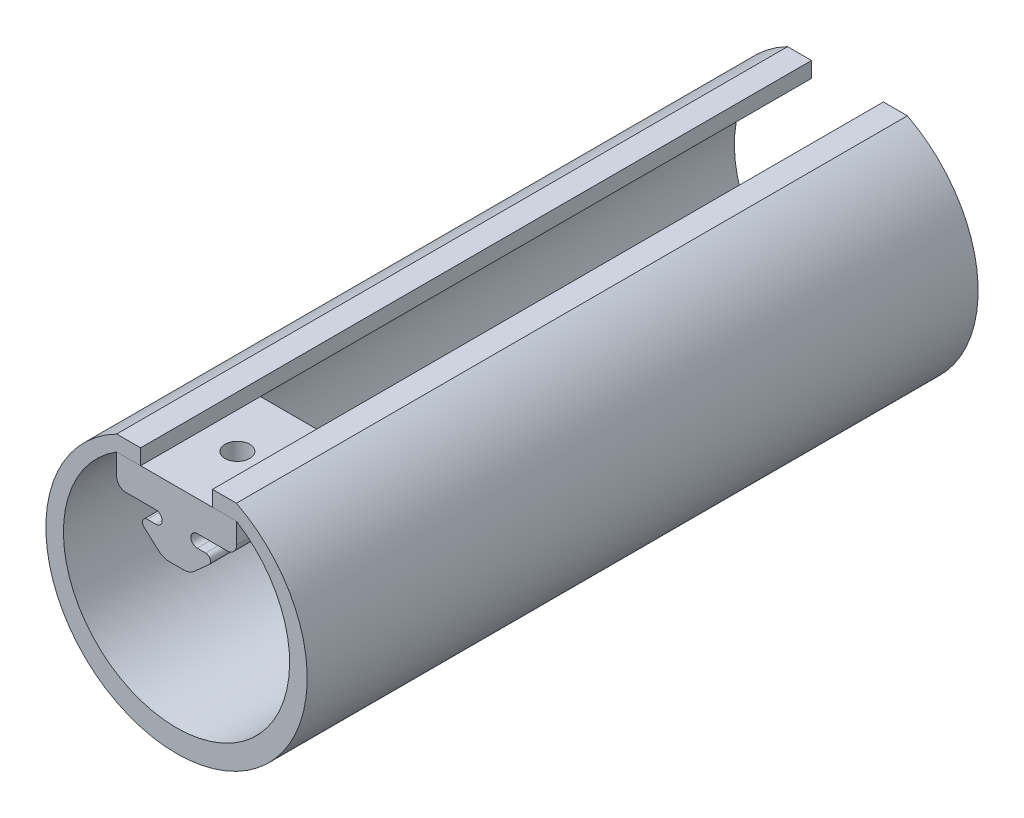
ISO-10303-21;
HEADER;
FILE_DESCRIPTION(('STEP AP214'),'2;1');
FILE_NAME('part.step','',(''),(''),'','','');
FILE_SCHEMA(('AUTOMOTIVE_DESIGN { 1 0 10303 214 1 1 1 1 }'));
ENDSEC;
DATA;
#1=APPLICATION_CONTEXT('core data for automotive mechanical design processes');
#2=APPLICATION_PROTOCOL_DEFINITION('international standard','automotive_design',2000,#1);
#3=PRODUCT_CONTEXT('',#1,'mechanical');
#4=PRODUCT('Part','Part','',(#3));
#5=PRODUCT_RELATED_PRODUCT_CATEGORY('part','',(#4));
#6=PRODUCT_DEFINITION_FORMATION('','',#4);
#7=PRODUCT_DEFINITION_CONTEXT('part definition',#1,'design');
#8=PRODUCT_DEFINITION('design','',#6,#7);
#9=PRODUCT_DEFINITION_SHAPE('','',#8);
#10=(LENGTH_UNIT() NAMED_UNIT(*) SI_UNIT(.MILLI.,.METRE.));
#11=(NAMED_UNIT(*) PLANE_ANGLE_UNIT() SI_UNIT($,.RADIAN.));
#12=(NAMED_UNIT(*) SI_UNIT($,.STERADIAN.) SOLID_ANGLE_UNIT());
#13=UNCERTAINTY_MEASURE_WITH_UNIT(LENGTH_MEASURE(1.E-05),#10,'distance_accuracy_value','');
#14=(GEOMETRIC_REPRESENTATION_CONTEXT(3) GLOBAL_UNCERTAINTY_ASSIGNED_CONTEXT((#13)) GLOBAL_UNIT_ASSIGNED_CONTEXT((#10,
#11,#12)) REPRESENTATION_CONTEXT('',''));
#15=CARTESIAN_POINT('',(0.,0.,0.));
#16=DIRECTION('',(0.,0.,1.));
#17=DIRECTION('',(1.,0.,0.));
#18=AXIS2_PLACEMENT_3D('',#15,#16,#17);
#19=CARTESIAN_POINT('',(0.00499999999999459,-0.919738421910336,-140.));
#20=DIRECTION('',(0.,0.,1.));
#21=DIRECTION('',(1.,0.,0.));
#22=AXIS2_PLACEMENT_3D('',#19,#20,#21);
#23=CYLINDRICAL_SURFACE('',#22,23.5974522798012);
#24=CARTESIAN_POINT('',(0.00499999999999459,-0.919738421910336,0.));
#25=DIRECTION('',(0.,0.,1.));
#26=DIRECTION('',(1.,0.,0.));
#27=AXIS2_PLACEMENT_3D('',#24,#25,#26);
#28=CIRCLE('',#27,23.5974522798012);
#29=CARTESIAN_POINT('',(-12.495,19.095,0.));
#30=VERTEX_POINT('',#29);
#31=CARTESIAN_POINT('',(12.505,19.095,0.));
#32=VERTEX_POINT('',#31);
#33=EDGE_CURVE('E158',#30,#32,#28,.T.);
#34=ORIENTED_EDGE('',*,*,#33,.T.);
#35=DIRECTION('',(0.,0.,1.));
#36=VECTOR('',#35,1.);
#37=CARTESIAN_POINT('',(12.505,19.095,-140.));
#38=LINE('',#37,#36);
#39=CARTESIAN_POINT('',(12.505,19.095,-140.));
#40=VERTEX_POINT('',#39);
#41=EDGE_CURVE('E12',#40,#32,#38,.T.);
#42=ORIENTED_EDGE('',*,*,#41,.F.);
#43=CARTESIAN_POINT('',(0.00499999999999459,-0.919738421910336,-140.));
#44=DIRECTION('',(0.,0.,1.));
#45=DIRECTION('',(1.,0.,0.));
#46=AXIS2_PLACEMENT_3D('',#43,#44,#45);
#47=CIRCLE('',#46,23.5974522798012);
#48=CARTESIAN_POINT('',(-12.495,19.095,-140.));
#49=VERTEX_POINT('',#48);
#50=EDGE_CURVE('E181',#49,#40,#47,.T.);
#51=ORIENTED_EDGE('',*,*,#50,.F.);
#52=DIRECTION('',(0.,0.,1.));
#53=VECTOR('',#52,1.);
#54=CARTESIAN_POINT('',(-12.495,19.095,-140.));
#55=LINE('',#54,#53);
#56=EDGE_CURVE('E62',#49,#30,#55,.T.);
#57=ORIENTED_EDGE('',*,*,#56,.T.);
#58=EDGE_LOOP('',(#34,#42,#51,#57));
#59=FACE_BOUND('',#58,.T.);
#60=ADVANCED_FACE('F59',(#59),#23,.F.);
#61=CARTESIAN_POINT('',(0.,19.095,-140.));
#62=DIRECTION('',(0.,1.,0.));
#63=DIRECTION('',(0.,0.,1.));
#64=AXIS2_PLACEMENT_3D('',#61,#62,#63);
#65=PLANE('',#64);
#66=DIRECTION('',(-1.,0.,0.));
#67=VECTOR('',#66,1.);
#68=CARTESIAN_POINT('',(0.,19.095,0.));
#69=LINE('',#68,#67);
#70=CARTESIAN_POINT('',(7.50499999999998,19.095,0.));
#71=VERTEX_POINT('',#70);
#72=EDGE_CURVE('E111',#32,#71,#69,.T.);
#73=ORIENTED_EDGE('',*,*,#72,.T.);
#74=DIRECTION('',(0.,0.,1.));
#75=VECTOR('',#74,1.);
#76=CARTESIAN_POINT('',(7.50499999999998,19.095,-140.));
#77=LINE('',#76,#75);
#78=CARTESIAN_POINT('',(7.50499999999998,19.095,-140.));
#79=VERTEX_POINT('',#78);
#80=EDGE_CURVE('E69',#79,#71,#77,.T.);
#81=ORIENTED_EDGE('',*,*,#80,.F.);
#82=DIRECTION('',(-1.,0.,0.));
#83=VECTOR('',#82,1.);
#84=CARTESIAN_POINT('',(0.,19.095,-140.));
#85=LINE('',#84,#83);
#86=EDGE_CURVE('E77',#40,#79,#85,.T.);
#87=ORIENTED_EDGE('',*,*,#86,.F.);
#88=ORIENTED_EDGE('',*,*,#41,.T.);
#89=EDGE_LOOP('',(#73,#81,#87,#88));
#90=FACE_BOUND('',#89,.T.);
#91=ADVANCED_FACE('F219',(#90),#65,.F.);
#92=CARTESIAN_POINT('',(7.50499999999998,0.,-140.));
#93=DIRECTION('',(-1.,0.,0.));
#94=DIRECTION('',(0.,0.,1.));
#95=AXIS2_PLACEMENT_3D('',#92,#93,#94);
#96=PLANE('',#95);
#97=DIRECTION('',(0.,-1.,0.));
#98=VECTOR('',#97,1.);
#99=CARTESIAN_POINT('',(7.50499999999998,0.,0.));
#100=LINE('',#99,#98);
#101=CARTESIAN_POINT('',(7.50499999999998,22.3323580948041,0.));
#102=VERTEX_POINT('',#101);
#103=EDGE_CURVE('E136',#102,#71,#100,.T.);
#104=ORIENTED_EDGE('',*,*,#103,.F.);
#105=DIRECTION('',(0.,0.,1.));
#106=VECTOR('',#105,1.);
#107=CARTESIAN_POINT('',(7.50499999999998,22.3323580948041,-140.));
#108=LINE('',#107,#106);
#109=CARTESIAN_POINT('',(7.50499999999998,22.3323580948041,-140.));
#110=VERTEX_POINT('',#109);
#111=EDGE_CURVE('E131',#110,#102,#108,.T.);
#112=ORIENTED_EDGE('',*,*,#111,.F.);
#113=DIRECTION('',(0.,-1.,0.));
#114=VECTOR('',#113,1.);
#115=CARTESIAN_POINT('',(7.50499999999998,0.,-140.));
#116=LINE('',#115,#114);
#117=EDGE_CURVE('E135',#110,#79,#116,.T.);
#118=ORIENTED_EDGE('',*,*,#117,.T.);
#119=ORIENTED_EDGE('',*,*,#80,.T.);
#120=EDGE_LOOP('',(#104,#112,#118,#119));
#121=FACE_BOUND('',#120,.T.);
#122=ADVANCED_FACE('F133',(#121),#96,.T.);
#123=CARTESIAN_POINT('',(0.,22.3323580948041,-140.));
#124=DIRECTION('',(0.,-1.,0.));
#125=DIRECTION('',(0.,0.,-1.));
#126=AXIS2_PLACEMENT_3D('',#123,#124,#125);
#127=PLANE('',#126);
#128=DIRECTION('',(1.,0.,0.));
#129=VECTOR('',#128,1.);
#130=CARTESIAN_POINT('',(0.,22.3323580948041,0.));
#131=LINE('',#130,#129);
#132=CARTESIAN_POINT('',(12.505,22.3323580948041,0.));
#133=VERTEX_POINT('',#132);
#134=EDGE_CURVE('E175',#102,#133,#131,.T.);
#135=ORIENTED_EDGE('',*,*,#134,.T.);
#136=DIRECTION('',(0.,0.,1.));
#137=VECTOR('',#136,1.);
#138=CARTESIAN_POINT('',(12.505,22.3323580948041,-140.));
#139=LINE('',#138,#137);
#140=CARTESIAN_POINT('',(12.505,22.3323580948041,-140.));
#141=VERTEX_POINT('',#140);
#142=EDGE_CURVE('E141',#141,#133,#139,.T.);
#143=ORIENTED_EDGE('',*,*,#142,.F.);
#144=DIRECTION('',(1.,0.,0.));
#145=VECTOR('',#144,1.);
#146=CARTESIAN_POINT('',(0.,22.3323580948041,-140.));
#147=LINE('',#146,#145);
#148=EDGE_CURVE('E144',#110,#141,#147,.T.);
#149=ORIENTED_EDGE('',*,*,#148,.F.);
#150=ORIENTED_EDGE('',*,*,#111,.T.);
#151=EDGE_LOOP('',(#135,#143,#149,#150));
#152=FACE_BOUND('',#151,.T.);
#153=ADVANCED_FACE('F145',(#152),#127,.F.);
#154=CARTESIAN_POINT('',(0.00499999999999459,-1.9006750931802,-140.));
#155=DIRECTION('',(0.,0.,1.));
#156=DIRECTION('',(1.,0.,0.));
#157=AXIS2_PLACEMENT_3D('',#154,#155,#156);
#158=CYLINDRICAL_SURFACE('',#157,27.2670111579899);
#159=CARTESIAN_POINT('',(0.00499999999999459,-1.9006750931802,0.));
#160=DIRECTION('',(0.,0.,1.));
#161=DIRECTION('',(1.,0.,0.));
#162=AXIS2_PLACEMENT_3D('',#159,#160,#161);
#163=CIRCLE('',#162,27.2670111579899);
#164=CARTESIAN_POINT('',(-12.495,22.3323580948041,0.));
#165=VERTEX_POINT('',#164);
#166=EDGE_CURVE('E171',#165,#133,#163,.T.);
#167=ORIENTED_EDGE('',*,*,#166,.F.);
#168=DIRECTION('',(0.,0.,1.));
#169=VECTOR('',#168,1.);
#170=CARTESIAN_POINT('',(-12.495,22.3323580948041,-140.));
#171=LINE('',#170,#169);
#172=CARTESIAN_POINT('',(-12.495,22.3323580948041,-140.));
#173=VERTEX_POINT('',#172);
#174=EDGE_CURVE('E187',#173,#165,#171,.T.);
#175=ORIENTED_EDGE('',*,*,#174,.F.);
#176=CARTESIAN_POINT('',(0.00499999999999459,-1.9006750931802,-140.));
#177=DIRECTION('',(0.,0.,1.));
#178=DIRECTION('',(1.,0.,0.));
#179=AXIS2_PLACEMENT_3D('',#176,#177,#178);
#180=CIRCLE('',#179,27.2670111579899);
#181=EDGE_CURVE('E149',#173,#141,#180,.T.);
#182=ORIENTED_EDGE('',*,*,#181,.T.);
#183=ORIENTED_EDGE('',*,*,#142,.T.);
#184=EDGE_LOOP('',(#167,#175,#182,#183));
#185=FACE_BOUND('',#184,.T.);
#186=ADVANCED_FACE('F232',(#185),#158,.T.);
#187=CARTESIAN_POINT('',(0.,22.3323580948041,-140.));
#188=DIRECTION('',(0.,-1.,0.));
#189=DIRECTION('',(0.,0.,-1.));
#190=AXIS2_PLACEMENT_3D('',#187,#188,#189);
#191=PLANE('',#190);
#192=DIRECTION('',(1.,0.,0.));
#193=VECTOR('',#192,1.);
#194=CARTESIAN_POINT('',(0.,22.3323580948041,0.));
#195=LINE('',#194,#193);
#196=CARTESIAN_POINT('',(-7.49499999999999,22.3323580948041,0.));
#197=VERTEX_POINT('',#196);
#198=EDGE_CURVE('E168',#165,#197,#195,.T.);
#199=ORIENTED_EDGE('',*,*,#198,.T.);
#200=DIRECTION('',(0.,0.,1.));
#201=VECTOR('',#200,1.);
#202=CARTESIAN_POINT('',(-7.49499999999999,22.3323580948041,-140.));
#203=LINE('',#202,#201);
#204=CARTESIAN_POINT('',(-7.49499999999999,22.3323580948041,-140.));
#205=VERTEX_POINT('',#204);
#206=EDGE_CURVE('E190',#205,#197,#203,.T.);
#207=ORIENTED_EDGE('',*,*,#206,.F.);
#208=DIRECTION('',(1.,0.,0.));
#209=VECTOR('',#208,1.);
#210=CARTESIAN_POINT('',(0.,22.3323580948041,-140.));
#211=LINE('',#210,#209);
#212=EDGE_CURVE('E246',#173,#205,#211,.T.);
#213=ORIENTED_EDGE('',*,*,#212,.F.);
#214=ORIENTED_EDGE('',*,*,#174,.T.);
#215=EDGE_LOOP('',(#199,#207,#213,#214));
#216=FACE_BOUND('',#215,.T.);
#217=ADVANCED_FACE('F215',(#216),#191,.F.);
#218=CARTESIAN_POINT('',(-7.49499999999999,0.,-140.));
#219=DIRECTION('',(-1.,0.,0.));
#220=DIRECTION('',(0.,-1.,0.));
#221=AXIS2_PLACEMENT_3D('',#218,#219,#220);
#222=PLANE('',#221);
#223=DIRECTION('',(0.,-1.,0.));
#224=VECTOR('',#223,1.);
#225=CARTESIAN_POINT('',(-7.49499999999999,0.,0.));
#226=LINE('',#225,#224);
#227=CARTESIAN_POINT('',(-7.49499999999999,19.095,0.));
#228=VERTEX_POINT('',#227);
#229=EDGE_CURVE('E165',#197,#228,#226,.T.);
#230=ORIENTED_EDGE('',*,*,#229,.T.);
#231=DIRECTION('',(0.,0.,1.));
#232=VECTOR('',#231,1.);
#233=CARTESIAN_POINT('',(-7.49499999999999,19.095,-140.));
#234=LINE('',#233,#232);
#235=CARTESIAN_POINT('',(-7.49499999999999,19.095,-140.));
#236=VERTEX_POINT('',#235);
#237=EDGE_CURVE('E193',#236,#228,#234,.T.);
#238=ORIENTED_EDGE('',*,*,#237,.F.);
#239=DIRECTION('',(0.,-1.,0.));
#240=VECTOR('',#239,1.);
#241=CARTESIAN_POINT('',(-7.49499999999999,0.,-140.));
#242=LINE('',#241,#240);
#243=EDGE_CURVE('E244',#205,#236,#242,.T.);
#244=ORIENTED_EDGE('',*,*,#243,.F.);
#245=ORIENTED_EDGE('',*,*,#206,.T.);
#246=EDGE_LOOP('',(#230,#238,#244,#245));
#247=FACE_BOUND('',#246,.T.);
#248=ADVANCED_FACE('F209',(#247),#222,.F.);
#249=CARTESIAN_POINT('',(0.,19.095,-140.));
#250=DIRECTION('',(0.,1.,0.));
#251=DIRECTION('',(0.,0.,1.));
#252=AXIS2_PLACEMENT_3D('',#249,#250,#251);
#253=PLANE('',#252);
#254=DIRECTION('',(-1.,0.,0.));
#255=VECTOR('',#254,1.);
#256=CARTESIAN_POINT('',(0.,19.095,0.));
#257=LINE('',#256,#255);
#258=EDGE_CURVE('E162',#228,#30,#257,.T.);
#259=ORIENTED_EDGE('',*,*,#258,.T.);
#260=ORIENTED_EDGE('',*,*,#56,.F.);
#261=DIRECTION('',(-1.,0.,0.));
#262=VECTOR('',#261,1.);
#263=CARTESIAN_POINT('',(0.,19.095,-140.));
#264=LINE('',#263,#262);
#265=EDGE_CURVE('E118',#236,#49,#264,.T.);
#266=ORIENTED_EDGE('',*,*,#265,.F.);
#267=ORIENTED_EDGE('',*,*,#237,.T.);
#268=EDGE_LOOP('',(#259,#260,#266,#267));
#269=FACE_BOUND('',#268,.T.);
#270=ADVANCED_FACE('F207',(#269),#253,.F.);
#271=CARTESIAN_POINT('',(0.,0.,-140.));
#272=DIRECTION('',(0.,0.,1.));
#273=DIRECTION('',(1.,0.,0.));
#274=AXIS2_PLACEMENT_3D('',#271,#272,#273);
#275=PLANE('',#274);
#276=ORIENTED_EDGE('',*,*,#50,.T.);
#277=ORIENTED_EDGE('',*,*,#86,.T.);
#278=ORIENTED_EDGE('',*,*,#117,.F.);
#279=ORIENTED_EDGE('',*,*,#148,.T.);
#280=ORIENTED_EDGE('',*,*,#181,.F.);
#281=ORIENTED_EDGE('',*,*,#212,.T.);
#282=ORIENTED_EDGE('',*,*,#243,.T.);
#283=ORIENTED_EDGE('',*,*,#265,.T.);
#284=EDGE_LOOP('',(#276,#277,#278,#279,#280,#281,#282,#283));
#285=FACE_BOUND('',#284,.T.);
#286=ADVANCED_FACE('F151',(#285),#275,.F.);
#287=CARTESIAN_POINT('',(0.,0.,0.));
#288=DIRECTION('',(0.,0.,1.));
#289=DIRECTION('',(1.,0.,0.));
#290=AXIS2_PLACEMENT_3D('',#287,#288,#289);
#291=PLANE('',#290);
#292=ORIENTED_EDGE('',*,*,#33,.F.);
#293=ORIENTED_EDGE('',*,*,#258,.F.);
#294=ORIENTED_EDGE('',*,*,#229,.F.);
#295=ORIENTED_EDGE('',*,*,#198,.F.);
#296=ORIENTED_EDGE('',*,*,#166,.T.);
#297=ORIENTED_EDGE('',*,*,#134,.F.);
#298=ORIENTED_EDGE('',*,*,#103,.T.);
#299=ORIENTED_EDGE('',*,*,#72,.F.);
#300=EDGE_LOOP('',(#292,#293,#294,#295,#296,#297,#298,#299));
#301=FACE_BOUND('',#300,.T.);
#302=ADVANCED_FACE('F204',(#301),#291,.T.);
#303=CLOSED_SHELL('',(#60,#91,#122,#153,#186,#217,#248,#270,#286,#302));
#304=MANIFOLD_SOLID_BREP('B2',#303);
#305=CARTESIAN_POINT('',(1.55040670748285,4.775,-25.));
#306=DIRECTION('',(0.,-1.,0.));
#307=DIRECTION('',(0.,0.,-1.));
#308=AXIS2_PLACEMENT_3D('',#305,#306,#307);
#309=PLANE('',#308);
#310=CARTESIAN_POINT('',(0.,4.775,-12.7));
#311=DIRECTION('',(0.,1.,0.));
#312=DIRECTION('',(1.,0.,0.));
#313=AXIS2_PLACEMENT_3D('',#310,#311,#312);
#314=CIRCLE('',#313,2.5796875);
#315=CARTESIAN_POINT('',(-1.55040670748285,4.775,-10.6381982056831));
#316=VERTEX_POINT('',#315);
#317=CARTESIAN_POINT('',(1.55040670748285,4.775,-10.6381982056831));
#318=VERTEX_POINT('',#317);
#319=EDGE_CURVE('E352',#316,#318,#314,.T.);
#320=ORIENTED_EDGE('',*,*,#319,.T.);
#321=DIRECTION('',(0.,0.,1.));
#322=VECTOR('',#321,1.);
#323=CARTESIAN_POINT('',(1.55040670748285,4.775,-25.));
#324=LINE('',#323,#322);
#325=CARTESIAN_POINT('',(1.55040670748285,4.775,0.));
#326=VERTEX_POINT('',#325);
#327=EDGE_CURVE('E567',#318,#326,#324,.T.);
#328=ORIENTED_EDGE('',*,*,#327,.T.);
#329=DIRECTION('',(1.,0.,0.));
#330=VECTOR('',#329,1.);
#331=CARTESIAN_POINT('',(1.55040670748285,4.775,0.));
#332=LINE('',#331,#330);
#333=CARTESIAN_POINT('',(-1.55040670748285,4.775,0.));
#334=VERTEX_POINT('',#333);
#335=EDGE_CURVE('E539',#334,#326,#332,.T.);
#336=ORIENTED_EDGE('',*,*,#335,.F.);
#337=DIRECTION('',(0.,0.,1.));
#338=VECTOR('',#337,1.);
#339=CARTESIAN_POINT('',(-1.55040670748285,4.775,-25.));
#340=LINE('',#339,#338);
#341=EDGE_CURVE('E571',#316,#334,#340,.T.);
#342=ORIENTED_EDGE('',*,*,#341,.F.);
#343=EDGE_LOOP('',(#320,#328,#336,#342));
#344=FACE_BOUND('',#343,.T.);
#345=ADVANCED_FACE('F335',(#344),#309,.T.);
#346=CARTESIAN_POINT('',(10.5420688349756,14.7079056929128,-25.));
#347=DIRECTION('',(0.,0.,1.));
#348=DIRECTION('',(1.,0.,0.));
#349=AXIS2_PLACEMENT_3D('',#346,#347,#348);
#350=CYLINDRICAL_SURFACE('',#349,1.96293116518964);
#351=CARTESIAN_POINT('',(10.5420688349756,14.7079056929128,0.));
#352=DIRECTION('',(0.,0.,1.));
#353=DIRECTION('',(1.,0.,0.));
#354=AXIS2_PLACEMENT_3D('',#351,#352,#353);
#355=CIRCLE('',#354,1.96293116518964);
#356=CARTESIAN_POINT('',(10.5320688348104,12.745,0.));
#357=VERTEX_POINT('',#356);
#358=CARTESIAN_POINT('',(12.505,14.7079311651897,0.));
#359=VERTEX_POINT('',#358);
#360=EDGE_CURVE('E505',#357,#359,#355,.T.);
#361=ORIENTED_EDGE('',*,*,#360,.F.);
#362=DIRECTION('',(0.,0.,1.));
#363=VECTOR('',#362,1.);
#364=CARTESIAN_POINT('',(10.5320688348104,12.745,-25.));
#365=LINE('',#364,#363);
#366=CARTESIAN_POINT('',(10.5320688348104,12.745,-25.));
#367=VERTEX_POINT('',#366);
#368=EDGE_CURVE('E57',#367,#357,#365,.T.);
#369=ORIENTED_EDGE('',*,*,#368,.F.);
#370=CARTESIAN_POINT('',(10.5420688349756,14.7079056929128,-25.));
#371=DIRECTION('',(0.,0.,1.));
#372=DIRECTION('',(1.,0.,0.));
#373=AXIS2_PLACEMENT_3D('',#370,#371,#372);
#374=CIRCLE('',#373,1.96293116518964);
#375=CARTESIAN_POINT('',(12.505,14.7079311651897,-25.));
#376=VERTEX_POINT('',#375);
#377=EDGE_CURVE('E556',#367,#376,#374,.T.);
#378=ORIENTED_EDGE('',*,*,#377,.T.);
#379=DIRECTION('',(0.,0.,1.));
#380=VECTOR('',#379,1.);
#381=CARTESIAN_POINT('',(12.505,14.7079311651897,-25.));
#382=LINE('',#381,#380);
#383=EDGE_CURVE('E339',#376,#359,#382,.T.);
#384=ORIENTED_EDGE('',*,*,#383,.T.);
#385=EDGE_LOOP('',(#361,#369,#378,#384));
#386=FACE_BOUND('',#385,.T.);
#387=ADVANCED_FACE('F337',(#386),#350,.T.);
#388=CARTESIAN_POINT('',(4.315,12.745,-25.));
#389=DIRECTION('',(0.,-1.,0.));
#390=DIRECTION('',(1.,0.,0.));
#391=AXIS2_PLACEMENT_3D('',#388,#389,#390);
#392=PLANE('',#391);
#393=DIRECTION('',(1.,0.,0.));
#394=VECTOR('',#393,1.);
#395=CARTESIAN_POINT('',(4.315,12.745,0.));
#396=LINE('',#395,#394);
#397=CARTESIAN_POINT('',(4.315,12.745,0.));
#398=VERTEX_POINT('',#397);
#399=EDGE_CURVE('E554',#398,#357,#396,.T.);
#400=ORIENTED_EDGE('',*,*,#399,.F.);
#401=DIRECTION('',(0.,0.,1.));
#402=VECTOR('',#401,1.);
#403=CARTESIAN_POINT('',(4.315,12.745,-25.));
#404=LINE('',#403,#402);
#405=CARTESIAN_POINT('',(4.315,12.745,-25.));
#406=VERTEX_POINT('',#405);
#407=EDGE_CURVE('E344',#406,#398,#404,.T.);
#408=ORIENTED_EDGE('',*,*,#407,.F.);
#409=DIRECTION('',(1.,0.,0.));
#410=VECTOR('',#409,1.);
#411=CARTESIAN_POINT('',(4.315,12.745,-25.));
#412=LINE('',#411,#410);
#413=EDGE_CURVE('E495',#406,#367,#412,.T.);
#414=ORIENTED_EDGE('',*,*,#413,.T.);
#415=ORIENTED_EDGE('',*,*,#368,.T.);
#416=EDGE_LOOP('',(#400,#408,#414,#415));
#417=FACE_BOUND('',#416,.T.);
#418=ADVANCED_FACE('F592',(#417),#392,.T.);
#419=CARTESIAN_POINT('',(4.315,11.43,-25.));
#420=DIRECTION('',(0.,0.,1.));
#421=DIRECTION('',(1.,0.,0.));
#422=AXIS2_PLACEMENT_3D('',#419,#420,#421);
#423=CYLINDRICAL_SURFACE('',#422,1.315);
#424=CARTESIAN_POINT('',(4.315,11.43,0.));
#425=DIRECTION('',(0.,0.,-1.));
#426=DIRECTION('',(-1.,0.,0.));
#427=AXIS2_PLACEMENT_3D('',#424,#425,#426);
#428=CIRCLE('',#427,1.315);
#429=CARTESIAN_POINT('',(4.315,10.115,0.));
#430=VERTEX_POINT('',#429);
#431=EDGE_CURVE('E482',#430,#398,#428,.T.);
#432=ORIENTED_EDGE('',*,*,#431,.F.);
#433=DIRECTION('',(0.,0.,1.));
#434=VECTOR('',#433,1.);
#435=CARTESIAN_POINT('',(4.315,10.115,-25.));
#436=LINE('',#435,#434);
#437=CARTESIAN_POINT('',(4.315,10.115,-25.));
#438=VERTEX_POINT('',#437);
#439=EDGE_CURVE('E476',#438,#430,#436,.T.);
#440=ORIENTED_EDGE('',*,*,#439,.F.);
#441=CARTESIAN_POINT('',(4.315,11.43,-25.));
#442=DIRECTION('',(0.,0.,-1.));
#443=DIRECTION('',(-1.,0.,0.));
#444=AXIS2_PLACEMENT_3D('',#441,#442,#443);
#445=CIRCLE('',#444,1.315);
#446=EDGE_CURVE('E479',#438,#406,#445,.T.);
#447=ORIENTED_EDGE('',*,*,#446,.T.);
#448=ORIENTED_EDGE('',*,*,#407,.T.);
#449=EDGE_LOOP('',(#432,#440,#447,#448));
#450=FACE_BOUND('',#449,.T.);
#451=ADVANCED_FACE('F478',(#450),#423,.F.);
#452=CARTESIAN_POINT('',(6.085,10.115,-25.));
#453=DIRECTION('',(0.,1.,0.));
#454=DIRECTION('',(-1.,0.,0.));
#455=AXIS2_PLACEMENT_3D('',#452,#453,#454);
#456=PLANE('',#455);
#457=DIRECTION('',(-1.,0.,0.));
#458=VECTOR('',#457,1.);
#459=CARTESIAN_POINT('',(6.085,10.115,0.));
#460=LINE('',#459,#458);
#461=CARTESIAN_POINT('',(6.085,10.115,0.));
#462=VERTEX_POINT('',#461);
#463=EDGE_CURVE('E551',#462,#430,#460,.T.);
#464=ORIENTED_EDGE('',*,*,#463,.F.);
#465=DIRECTION('',(0.,0.,1.));
#466=VECTOR('',#465,1.);
#467=CARTESIAN_POINT('',(6.085,10.115,-25.));
#468=LINE('',#467,#466);
#469=CARTESIAN_POINT('',(6.085,10.115,-25.));
#470=VERTEX_POINT('',#469);
#471=EDGE_CURVE('E487',#470,#462,#468,.T.);
#472=ORIENTED_EDGE('',*,*,#471,.F.);
#473=DIRECTION('',(-1.,0.,0.));
#474=VECTOR('',#473,1.);
#475=CARTESIAN_POINT('',(6.085,10.115,-25.));
#476=LINE('',#475,#474);
#477=EDGE_CURVE('E493',#470,#438,#476,.T.);
#478=ORIENTED_EDGE('',*,*,#477,.T.);
#479=ORIENTED_EDGE('',*,*,#439,.T.);
#480=EDGE_LOOP('',(#464,#472,#478,#479));
#481=FACE_BOUND('',#480,.T.);
#482=ADVANCED_FACE('F497',(#481),#456,.T.);
#483=CARTESIAN_POINT('',(6.085,9.105,-25.));
#484=DIRECTION('',(0.,0.,1.));
#485=DIRECTION('',(1.,0.,0.));
#486=AXIS2_PLACEMENT_3D('',#483,#484,#485);
#487=CYLINDRICAL_SURFACE('',#486,1.01);
#488=CARTESIAN_POINT('',(6.085,9.105,0.));
#489=DIRECTION('',(0.,0.,1.));
#490=DIRECTION('',(-1.,0.,0.));
#491=AXIS2_PLACEMENT_3D('',#488,#489,#490);
#492=CIRCLE('',#491,1.01);
#493=CARTESIAN_POINT('',(6.75861440261653,8.3524419380622,0.));
#494=VERTEX_POINT('',#493);
#495=EDGE_CURVE('E548',#494,#462,#492,.T.);
#496=ORIENTED_EDGE('',*,*,#495,.F.);
#497=DIRECTION('',(0.,0.,1.));
#498=VECTOR('',#497,1.);
#499=CARTESIAN_POINT('',(6.75861440261653,8.3524419380622,-25.));
#500=LINE('',#499,#498);
#501=CARTESIAN_POINT('',(6.75861440261653,8.3524419380622,-25.));
#502=VERTEX_POINT('',#501);
#503=EDGE_CURVE('E560',#502,#494,#500,.T.);
#504=ORIENTED_EDGE('',*,*,#503,.F.);
#505=CARTESIAN_POINT('',(6.085,9.105,-25.));
#506=DIRECTION('',(0.,0.,1.));
#507=DIRECTION('',(-1.,0.,0.));
#508=AXIS2_PLACEMENT_3D('',#505,#506,#507);
#509=CIRCLE('',#508,1.01);
#510=EDGE_CURVE('E498',#502,#470,#509,.T.);
#511=ORIENTED_EDGE('',*,*,#510,.T.);
#512=ORIENTED_EDGE('',*,*,#471,.T.);
#513=EDGE_LOOP('',(#496,#504,#511,#512));
#514=FACE_BOUND('',#513,.T.);
#515=ADVANCED_FACE('F809',(#514),#487,.T.);
#516=CARTESIAN_POINT('',(3.66462220876442,5.58301083530413,-25.));
#517=DIRECTION('',(0.66694495308567,-0.745106992017625,0.));
#518=DIRECTION('',(0.745106992017625,0.66694495308567,0.));
#519=AXIS2_PLACEMENT_3D('',#516,#517,#518);
#520=PLANE('',#519);
#521=DIRECTION('',(0.745106992017625,0.66694495308567,0.));
#522=VECTOR('',#521,1.);
#523=CARTESIAN_POINT('',(3.66462220876442,5.58301083530413,0.));
#524=LINE('',#523,#522);
#525=CARTESIAN_POINT('',(3.66462220876443,5.58301083530413,0.));
#526=VERTEX_POINT('',#525);
#527=EDGE_CURVE('E545',#526,#494,#524,.T.);
#528=ORIENTED_EDGE('',*,*,#527,.F.);
#529=DIRECTION('',(0.,0.,1.));
#530=VECTOR('',#529,1.);
#531=CARTESIAN_POINT('',(3.66462220876443,5.58301083530413,-25.));
#532=LINE('',#531,#530);
#533=CARTESIAN_POINT('',(3.66462220876443,5.58301083530413,-25.));
#534=VERTEX_POINT('',#533);
#535=EDGE_CURVE('E562',#534,#526,#532,.T.);
#536=ORIENTED_EDGE('',*,*,#535,.F.);
#537=DIRECTION('',(0.745106992017625,0.66694495308567,0.));
#538=VECTOR('',#537,1.);
#539=CARTESIAN_POINT('',(3.66462220876442,5.58301083530413,-25.));
#540=LINE('',#539,#538);
#541=EDGE_CURVE('E500',#534,#502,#540,.T.);
#542=ORIENTED_EDGE('',*,*,#541,.T.);
#543=ORIENTED_EDGE('',*,*,#503,.T.);
#544=EDGE_LOOP('',(#528,#536,#542,#543));
#545=FACE_BOUND('',#544,.T.);
#546=ADVANCED_FACE('F619',(#545),#520,.T.);
#547=CARTESIAN_POINT('',(1.55040670748285,7.945,-25.));
#548=DIRECTION('',(0.,0.,1.));
#549=DIRECTION('',(1.,0.,0.));
#550=AXIS2_PLACEMENT_3D('',#547,#548,#549);
#551=CYLINDRICAL_SURFACE('',#550,3.17);
#552=CARTESIAN_POINT('',(1.55040670748285,4.775,-14.7618017943169));
#553=CARTESIAN_POINT('',(1.60740604045821,4.77499829120057,-14.7189442153994));
#554=CARTESIAN_POINT('',(1.66257781547106,4.77653731473618,-14.6737514092));
#555=CARTESIAN_POINT('',(1.76889322437959,4.78209114792903,-14.5790601482722));
#556=CARTESIAN_POINT('',(1.8200397355736,4.78610417068436,-14.5295648232791));
#557=CARTESIAN_POINT('',(1.96675242160227,4.80092576356998,-14.3753361028821));
#558=CARTESIAN_POINT('',(2.05588565359025,4.81452303115963,-14.2646380502744));
#559=CARTESIAN_POINT('',(2.21449192978436,4.84428771040433,-14.0307074588259));
#560=CARTESIAN_POINT('',(2.28400175412247,4.86045022395167,-13.9074989658865));
#561=CARTESIAN_POINT('',(2.40208492778134,4.89094173572603,-13.6511445881945));
#562=CARTESIAN_POINT('',(2.45065409260614,4.90527036709316,-13.5179967235234));
#563=CARTESIAN_POINT('',(2.5265358132137,4.92875618427653,-13.2409544194539));
#564=CARTESIAN_POINT('',(2.55316856059788,4.93774573071455,-13.0968575992915));
#565=CARTESIAN_POINT('',(2.58164280081133,4.94738521681886,-12.8059969458529));
#566=CARTESIAN_POINT('',(2.5834968215375,4.94803937077535,-12.6592344978822));
#567=CARTESIAN_POINT('',(2.56292430361789,4.94103637635508,-12.3753134598267));
#568=CARTESIAN_POINT('',(2.54174874989054,4.93380739133914,-12.238050777274));
#569=CARTESIAN_POINT('',(2.47782190838669,4.91351351507231,-11.969028095893));
#570=CARTESIAN_POINT('',(2.43505524938557,4.90044446690321,-11.8372720898594));
#571=CARTESIAN_POINT('',(2.32818141432141,4.87138999447564,-11.5801199210287));
#572=CARTESIAN_POINT('',(2.26368296217278,4.85535372422185,-11.4548928775934));
#573=CARTESIAN_POINT('',(2.11514865887475,4.82479365840991,-11.2165573027427));
#574=CARTESIAN_POINT('',(2.03113896127296,4.81026787554665,-11.1034328425033));
#575=CARTESIAN_POINT('',(1.88018012417873,4.7916558313887,-10.9315294685844));
#576=CARTESIAN_POINT('',(1.8185579372326,4.78569660671739,-10.8682201108708));
#577=CARTESIAN_POINT('',(1.68903568915766,4.77736654680655,-10.748139136869));
#578=CARTESIAN_POINT('',(1.62113573935703,4.77499564794554,-10.6913674046842));
#579=CARTESIAN_POINT('',(1.55040670748285,4.775,-10.6381982056831));
#580=B_SPLINE_CURVE_WITH_KNOTS('',3,(#552,#553,#554,#555,#556,#557,#558,#559,#560,#561,#562,
#563,#564,#565,#566,#567,#568,#569,#570,#571,#572,#573,#574,#575,#576,#577,#578,#579),
.UNSPECIFIED.,.F.,.F.,(4,2,2,2,2,2,2,2,2,2,2,2,2,4),(0.,0.213764562147627,0.427374908600162,
0.853505887428197,1.27883278487419,1.70424463450298,2.14239063810355,2.58031511071875,
2.99558733329452,3.41115561588503,3.83464594255289,4.25757185141178,4.52272455689054,
4.78787256112298),.UNSPECIFIED.);
#581=CARTESIAN_POINT('',(1.55040670748285,4.775,-14.7618017943169));
#582=VERTEX_POINT('',#581);
#583=EDGE_CURVE('E509',#582,#318,#580,.T.);
#584=ORIENTED_EDGE('',*,*,#583,.F.);
#585=CARTESIAN_POINT('',(1.55040670748285,4.775,-25.));
#586=VERTEX_POINT('',#585);
#587=EDGE_CURVE('E564',#586,#582,#324,.T.);
#588=ORIENTED_EDGE('',*,*,#587,.F.);
#589=CARTESIAN_POINT('',(1.55040670748285,7.945,-25.));
#590=DIRECTION('',(0.,0.,1.));
#591=DIRECTION('',(-1.,0.,0.));
#592=AXIS2_PLACEMENT_3D('',#589,#590,#591);
#593=CIRCLE('',#592,3.17);
#594=EDGE_CURVE('E641',#586,#534,#593,.T.);
#595=ORIENTED_EDGE('',*,*,#594,.T.);
#596=ORIENTED_EDGE('',*,*,#535,.T.);
#597=CARTESIAN_POINT('',(1.55040670748285,7.945,0.));
#598=DIRECTION('',(0.,0.,1.));
#599=DIRECTION('',(-1.,0.,0.));
#600=AXIS2_PLACEMENT_3D('',#597,#598,#599);
#601=CIRCLE('',#600,3.17);
#602=EDGE_CURVE('E542',#326,#526,#601,.T.);
#603=ORIENTED_EDGE('',*,*,#602,.F.);
#604=ORIENTED_EDGE('',*,*,#327,.F.);
#605=EDGE_LOOP('',(#584,#588,#595,#596,#603,#604));
#606=FACE_BOUND('',#605,.T.);
#607=ADVANCED_FACE('F611',(#606),#551,.T.);
#608=CARTESIAN_POINT('',(-1.55040670748285,4.775,-14.7618017943169));
#609=VERTEX_POINT('',#608);
#610=EDGE_CURVE('E624',#582,#609,#314,.T.);
#611=ORIENTED_EDGE('',*,*,#610,.T.);
#612=CARTESIAN_POINT('',(-1.55040670748285,4.775,-25.));
#613=VERTEX_POINT('',#612);
#614=EDGE_CURVE('E568',#613,#609,#340,.T.);
#615=ORIENTED_EDGE('',*,*,#614,.F.);
#616=DIRECTION('',(1.,0.,0.));
#617=VECTOR('',#616,1.);
#618=CARTESIAN_POINT('',(1.55040670748285,4.775,-25.));
#619=LINE('',#618,#617);
#620=EDGE_CURVE('E638',#613,#586,#619,.T.);
#621=ORIENTED_EDGE('',*,*,#620,.T.);
#622=ORIENTED_EDGE('',*,*,#587,.T.);
#623=EDGE_LOOP('',(#611,#615,#621,#622));
#624=FACE_BOUND('',#623,.T.);
#625=ADVANCED_FACE('F604',(#624),#309,.T.);
#626=CARTESIAN_POINT('',(-1.55040670748285,7.945,-25.));
#627=DIRECTION('',(0.,0.,1.));
#628=DIRECTION('',(1.,0.,0.));
#629=AXIS2_PLACEMENT_3D('',#626,#627,#628);
#630=CYLINDRICAL_SURFACE('',#629,3.17);
#631=CARTESIAN_POINT('',(-1.55040670748285,4.775,-10.6381982056831));
#632=CARTESIAN_POINT('',(-1.60740604045821,4.77499829120057,-10.6810557846006));
#633=CARTESIAN_POINT('',(-1.66257781547106,4.77653731473618,-10.7262485908));
#634=CARTESIAN_POINT('',(-1.76889322437958,4.78209114792903,-10.8209398517278));
#635=CARTESIAN_POINT('',(-1.8200397355736,4.78610417068436,-10.8704351767209));
#636=CARTESIAN_POINT('',(-1.96675242160227,4.80092576356998,-11.0246638971179));
#637=CARTESIAN_POINT('',(-2.05588565359025,4.81452303115963,-11.1353619497256));
#638=CARTESIAN_POINT('',(-2.21449192978436,4.84428771040433,-11.3692925411741));
#639=CARTESIAN_POINT('',(-2.28400175412247,4.86045022395167,-11.4925010341135));
#640=CARTESIAN_POINT('',(-2.40208492778134,4.89094173572603,-11.7488554118055));
#641=CARTESIAN_POINT('',(-2.45065409260614,4.90527036709316,-11.8820032764766));
#642=CARTESIAN_POINT('',(-2.5265358132137,4.92875618427653,-12.1590455805461));
#643=CARTESIAN_POINT('',(-2.55316856059788,4.93774573071455,-12.3031424007085));
#644=CARTESIAN_POINT('',(-2.58164280081134,4.94738521681886,-12.5940030541471));
#645=CARTESIAN_POINT('',(-2.5834968215375,4.94803937077535,-12.7407655021178));
#646=CARTESIAN_POINT('',(-2.56292430361789,4.94103637635508,-13.0246865401733));
#647=CARTESIAN_POINT('',(-2.54174874989054,4.93380739133914,-13.161949222726));
#648=CARTESIAN_POINT('',(-2.47782190838669,4.91351351507232,-13.430971904107));
#649=CARTESIAN_POINT('',(-2.43505524938557,4.90044446690321,-13.5627279101406));
#650=CARTESIAN_POINT('',(-2.32818141432142,4.87138999447565,-13.8198800789713));
#651=CARTESIAN_POINT('',(-2.26368296217278,4.85535372422185,-13.9451071224066));
#652=CARTESIAN_POINT('',(-2.11514865887475,4.82479365840991,-14.1834426972573));
#653=CARTESIAN_POINT('',(-2.03113896127297,4.81026787554665,-14.2965671574967));
#654=CARTESIAN_POINT('',(-1.88018012417873,4.7916558313887,-14.4684705314156));
#655=CARTESIAN_POINT('',(-1.8185579372326,4.78569660671739,-14.5317798891292));
#656=CARTESIAN_POINT('',(-1.68903568915766,4.77736654680655,-14.651860863131));
#657=CARTESIAN_POINT('',(-1.62113573935704,4.77499564794554,-14.7086325953158));
#658=CARTESIAN_POINT('',(-1.55040670748285,4.775,-14.7618017943169));
#659=B_SPLINE_CURVE_WITH_KNOTS('',3,(#631,#632,#633,#634,#635,#636,#637,#638,#639,#640,#641,
#642,#643,#644,#645,#646,#647,#648,#649,#650,#651,#652,#653,#654,#655,#656,#657,#658),
.UNSPECIFIED.,.F.,.F.,(4,2,2,2,2,2,2,2,2,2,2,2,2,4),(0.,0.213764562147627,0.427374908600162,
0.853505887428196,1.27883278487418,1.70424463450298,2.14239063810355,2.58031511071874,
2.99558733329451,3.41115561588503,3.83464594255288,4.25757185141178,4.52272455689054,
4.78787256112298),.UNSPECIFIED.);
#660=EDGE_CURVE('E629',#316,#609,#659,.T.);
#661=ORIENTED_EDGE('',*,*,#660,.F.);
#662=ORIENTED_EDGE('',*,*,#341,.T.);
#663=CARTESIAN_POINT('',(-1.55040670748285,7.945,0.));
#664=DIRECTION('',(0.,0.,1.));
#665=DIRECTION('',(1.,0.,0.));
#666=AXIS2_PLACEMENT_3D('',#663,#664,#665);
#667=CIRCLE('',#666,3.17);
#668=CARTESIAN_POINT('',(-3.66462220876442,5.58301083530413,0.));
#669=VERTEX_POINT('',#668);
#670=EDGE_CURVE('E536',#669,#334,#667,.T.);
#671=ORIENTED_EDGE('',*,*,#670,.F.);
#672=DIRECTION('',(0.,0.,1.));
#673=VECTOR('',#672,1.);
#674=CARTESIAN_POINT('',(-3.66462220876442,5.58301083530413,-25.));
#675=LINE('',#674,#673);
#676=CARTESIAN_POINT('',(-3.66462220876442,5.58301083530413,-25.));
#677=VERTEX_POINT('',#676);
#678=EDGE_CURVE('E572',#677,#669,#675,.T.);
#679=ORIENTED_EDGE('',*,*,#678,.F.);
#680=CARTESIAN_POINT('',(-1.55040670748285,7.945,-25.));
#681=DIRECTION('',(0.,0.,1.));
#682=DIRECTION('',(1.,0.,0.));
#683=AXIS2_PLACEMENT_3D('',#680,#681,#682);
#684=CIRCLE('',#683,3.17);
#685=EDGE_CURVE('E634',#677,#613,#684,.T.);
#686=ORIENTED_EDGE('',*,*,#685,.T.);
#687=ORIENTED_EDGE('',*,*,#614,.T.);
#688=EDGE_LOOP('',(#661,#662,#671,#679,#686,#687));
#689=FACE_BOUND('',#688,.T.);
#690=ADVANCED_FACE('F610',(#689),#630,.T.);
#691=CARTESIAN_POINT('',(-3.66462220876442,5.58301083530413,-25.));
#692=DIRECTION('',(-0.66694495308567,-0.745106992017626,0.));
#693=DIRECTION('',(0.745106992017626,-0.66694495308567,0.));
#694=AXIS2_PLACEMENT_3D('',#691,#692,#693);
#695=PLANE('',#694);
#696=DIRECTION('',(0.745106992017625,-0.66694495308567,0.));
#697=VECTOR('',#696,1.);
#698=CARTESIAN_POINT('',(-3.66462220876442,5.58301083530413,0.));
#699=LINE('',#698,#697);
#700=CARTESIAN_POINT('',(-6.75861440261652,8.3524419380622,0.));
#701=VERTEX_POINT('',#700);
#702=EDGE_CURVE('E533',#701,#669,#699,.T.);
#703=ORIENTED_EDGE('',*,*,#702,.F.);
#704=DIRECTION('',(0.,0.,1.));
#705=VECTOR('',#704,1.);
#706=CARTESIAN_POINT('',(-6.75861440261652,8.3524419380622,-25.));
#707=LINE('',#706,#705);
#708=CARTESIAN_POINT('',(-6.75861440261652,8.3524419380622,-25.));
#709=VERTEX_POINT('',#708);
#710=EDGE_CURVE('E574',#709,#701,#707,.T.);
#711=ORIENTED_EDGE('',*,*,#710,.F.);
#712=DIRECTION('',(0.745106992017625,-0.66694495308567,0.));
#713=VECTOR('',#712,1.);
#714=CARTESIAN_POINT('',(-3.66462220876442,5.58301083530413,-25.));
#715=LINE('',#714,#713);
#716=EDGE_CURVE('E639',#709,#677,#715,.T.);
#717=ORIENTED_EDGE('',*,*,#716,.T.);
#718=ORIENTED_EDGE('',*,*,#678,.T.);
#719=EDGE_LOOP('',(#703,#711,#717,#718));
#720=FACE_BOUND('',#719,.T.);
#721=ADVANCED_FACE('F617',(#720),#695,.T.);
#722=CARTESIAN_POINT('',(-6.085,9.105,-25.));
#723=DIRECTION('',(0.,0.,1.));
#724=DIRECTION('',(1.,0.,0.));
#725=AXIS2_PLACEMENT_3D('',#722,#723,#724);
#726=CYLINDRICAL_SURFACE('',#725,1.01);
#727=CARTESIAN_POINT('',(-6.085,9.105,0.));
#728=DIRECTION('',(0.,0.,1.));
#729=DIRECTION('',(1.,0.,0.));
#730=AXIS2_PLACEMENT_3D('',#727,#728,#729);
#731=CIRCLE('',#730,1.01);
#732=CARTESIAN_POINT('',(-6.085,10.115,0.));
#733=VERTEX_POINT('',#732);
#734=EDGE_CURVE('E530',#733,#701,#731,.T.);
#735=ORIENTED_EDGE('',*,*,#734,.F.);
#736=DIRECTION('',(0.,0.,1.));
#737=VECTOR('',#736,1.);
#738=CARTESIAN_POINT('',(-6.085,10.115,-25.));
#739=LINE('',#738,#737);
#740=CARTESIAN_POINT('',(-6.085,10.115,-25.));
#741=VERTEX_POINT('',#740);
#742=EDGE_CURVE('E576',#741,#733,#739,.T.);
#743=ORIENTED_EDGE('',*,*,#742,.F.);
#744=CARTESIAN_POINT('',(-6.085,9.105,-25.));
#745=DIRECTION('',(0.,0.,1.));
#746=DIRECTION('',(1.,0.,0.));
#747=AXIS2_PLACEMENT_3D('',#744,#745,#746);
#748=CIRCLE('',#747,1.01);
#749=EDGE_CURVE('E643',#741,#709,#748,.T.);
#750=ORIENTED_EDGE('',*,*,#749,.T.);
#751=ORIENTED_EDGE('',*,*,#710,.T.);
#752=EDGE_LOOP('',(#735,#743,#750,#751));
#753=FACE_BOUND('',#752,.T.);
#754=ADVANCED_FACE('F785',(#753),#726,.T.);
#755=CARTESIAN_POINT('',(-6.085,10.115,-25.));
#756=DIRECTION('',(0.,1.,0.));
#757=DIRECTION('',(-1.,0.,0.));
#758=AXIS2_PLACEMENT_3D('',#755,#756,#757);
#759=PLANE('',#758);
#760=DIRECTION('',(-1.,0.,0.));
#761=VECTOR('',#760,1.);
#762=CARTESIAN_POINT('',(-6.085,10.115,0.));
#763=LINE('',#762,#761);
#764=CARTESIAN_POINT('',(-4.315,10.115,0.));
#765=VERTEX_POINT('',#764);
#766=EDGE_CURVE('E527',#765,#733,#763,.T.);
#767=ORIENTED_EDGE('',*,*,#766,.F.);
#768=DIRECTION('',(0.,0.,1.));
#769=VECTOR('',#768,1.);
#770=CARTESIAN_POINT('',(-4.315,10.115,-25.));
#771=LINE('',#770,#769);
#772=CARTESIAN_POINT('',(-4.315,10.115,-25.));
#773=VERTEX_POINT('',#772);
#774=EDGE_CURVE('E578',#773,#765,#771,.T.);
#775=ORIENTED_EDGE('',*,*,#774,.F.);
#776=DIRECTION('',(-1.,0.,0.));
#777=VECTOR('',#776,1.);
#778=CARTESIAN_POINT('',(-6.085,10.115,-25.));
#779=LINE('',#778,#777);
#780=EDGE_CURVE('E872',#773,#741,#779,.T.);
#781=ORIENTED_EDGE('',*,*,#780,.T.);
#782=ORIENTED_EDGE('',*,*,#742,.T.);
#783=EDGE_LOOP('',(#767,#775,#781,#782));
#784=FACE_BOUND('',#783,.T.);
#785=ADVANCED_FACE('F775',(#784),#759,.T.);
#786=CARTESIAN_POINT('',(-4.315,11.43,-25.));
#787=DIRECTION('',(0.,0.,1.));
#788=DIRECTION('',(1.,0.,0.));
#789=AXIS2_PLACEMENT_3D('',#786,#787,#788);
#790=CYLINDRICAL_SURFACE('',#789,1.315);
#791=CARTESIAN_POINT('',(-4.315,11.43,0.));
#792=DIRECTION('',(0.,0.,-1.));
#793=DIRECTION('',(1.,0.,0.));
#794=AXIS2_PLACEMENT_3D('',#791,#792,#793);
#795=CIRCLE('',#794,1.315);
#796=CARTESIAN_POINT('',(-4.315,12.745,0.));
#797=VERTEX_POINT('',#796);
#798=EDGE_CURVE('E524',#797,#765,#795,.T.);
#799=ORIENTED_EDGE('',*,*,#798,.F.);
#800=DIRECTION('',(0.,0.,1.));
#801=VECTOR('',#800,1.);
#802=CARTESIAN_POINT('',(-4.315,12.745,-25.));
#803=LINE('',#802,#801);
#804=CARTESIAN_POINT('',(-4.315,12.745,-25.));
#805=VERTEX_POINT('',#804);
#806=EDGE_CURVE('E580',#805,#797,#803,.T.);
#807=ORIENTED_EDGE('',*,*,#806,.F.);
#808=CARTESIAN_POINT('',(-4.315,11.43,-25.));
#809=DIRECTION('',(0.,0.,-1.));
#810=DIRECTION('',(1.,0.,0.));
#811=AXIS2_PLACEMENT_3D('',#808,#809,#810);
#812=CIRCLE('',#811,1.315);
#813=EDGE_CURVE('E868',#805,#773,#812,.T.);
#814=ORIENTED_EDGE('',*,*,#813,.T.);
#815=ORIENTED_EDGE('',*,*,#774,.T.);
#816=EDGE_LOOP('',(#799,#807,#814,#815));
#817=FACE_BOUND('',#816,.T.);
#818=ADVANCED_FACE('F765',(#817),#790,.F.);
#819=CARTESIAN_POINT('',(-4.315,12.745,-25.));
#820=DIRECTION('',(0.,-1.,0.));
#821=DIRECTION('',(1.,0.,0.));
#822=AXIS2_PLACEMENT_3D('',#819,#820,#821);
#823=PLANE('',#822);
#824=DIRECTION('',(1.,0.,0.));
#825=VECTOR('',#824,1.);
#826=CARTESIAN_POINT('',(-4.315,12.745,0.));
#827=LINE('',#826,#825);
#828=CARTESIAN_POINT('',(-10.5320688348104,12.745,0.));
#829=VERTEX_POINT('',#828);
#830=EDGE_CURVE('E521',#829,#797,#827,.T.);
#831=ORIENTED_EDGE('',*,*,#830,.F.);
#832=DIRECTION('',(0.,0.,1.));
#833=VECTOR('',#832,1.);
#834=CARTESIAN_POINT('',(-10.5320688348104,12.745,-25.));
#835=LINE('',#834,#833);
#836=CARTESIAN_POINT('',(-10.5320688348104,12.745,-25.));
#837=VERTEX_POINT('',#836);
#838=EDGE_CURVE('E582',#837,#829,#835,.T.);
#839=ORIENTED_EDGE('',*,*,#838,.F.);
#840=DIRECTION('',(1.,0.,0.));
#841=VECTOR('',#840,1.);
#842=CARTESIAN_POINT('',(-4.315,12.745,-25.));
#843=LINE('',#842,#841);
#844=EDGE_CURVE('E879',#837,#805,#843,.T.);
#845=ORIENTED_EDGE('',*,*,#844,.T.);
#846=ORIENTED_EDGE('',*,*,#806,.T.);
#847=EDGE_LOOP('',(#831,#839,#845,#846));
#848=FACE_BOUND('',#847,.T.);
#849=ADVANCED_FACE('F755',(#848),#823,.T.);
#850=CARTESIAN_POINT('',(-10.5320688348104,14.7079311651896,-25.));
#851=DIRECTION('',(0.,0.,1.));
#852=DIRECTION('',(1.,0.,0.));
#853=AXIS2_PLACEMENT_3D('',#850,#851,#852);
#854=CYLINDRICAL_SURFACE('',#853,1.96293116518964);
#855=CARTESIAN_POINT('',(-10.5320688348104,14.7079311651896,0.));
#856=DIRECTION('',(0.,0.,1.));
#857=DIRECTION('',(-1.,0.,0.));
#858=AXIS2_PLACEMENT_3D('',#855,#856,#857);
#859=CIRCLE('',#858,1.96293116518964);
#860=CARTESIAN_POINT('',(-12.495,14.7079311651897,0.));
#861=VERTEX_POINT('',#860);
#862=EDGE_CURVE('E518',#861,#829,#859,.T.);
#863=ORIENTED_EDGE('',*,*,#862,.F.);
#864=DIRECTION('',(0.,0.,1.));
#865=VECTOR('',#864,1.);
#866=CARTESIAN_POINT('',(-12.495,14.7079311651897,-25.));
#867=LINE('',#866,#865);
#868=CARTESIAN_POINT('',(-12.495,14.7079311651897,-25.));
#869=VERTEX_POINT('',#868);
#870=EDGE_CURVE('E584',#869,#861,#867,.T.);
#871=ORIENTED_EDGE('',*,*,#870,.F.);
#872=CARTESIAN_POINT('',(-10.5320688348104,14.7079311651896,-25.));
#873=DIRECTION('',(0.,0.,1.));
#874=DIRECTION('',(-1.,0.,0.));
#875=AXIS2_PLACEMENT_3D('',#872,#873,#874);
#876=CIRCLE('',#875,1.96293116518964);
#877=EDGE_CURVE('E861',#869,#837,#876,.T.);
#878=ORIENTED_EDGE('',*,*,#877,.T.);
#879=ORIENTED_EDGE('',*,*,#838,.T.);
#880=EDGE_LOOP('',(#863,#871,#878,#879));
#881=FACE_BOUND('',#880,.T.);
#882=ADVANCED_FACE('F745',(#881),#854,.T.);
#883=CARTESIAN_POINT('',(-12.495,14.7079311651897,-25.));
#884=DIRECTION('',(-1.,0.,0.));
#885=DIRECTION('',(0.,0.,1.));
#886=AXIS2_PLACEMENT_3D('',#883,#884,#885);
#887=PLANE('',#886);
#888=DIRECTION('',(0.,-1.,0.));
#889=VECTOR('',#888,1.);
#890=CARTESIAN_POINT('',(-12.495,14.7079311651897,0.));
#891=LINE('',#890,#889);
#892=CARTESIAN_POINT('',(-12.495,19.095,0.));
#893=VERTEX_POINT('',#892);
#894=EDGE_CURVE('E515',#893,#861,#891,.T.);
#895=ORIENTED_EDGE('',*,*,#894,.F.);
#896=DIRECTION('',(0.,0.,1.));
#897=VECTOR('',#896,1.);
#898=CARTESIAN_POINT('',(-12.495,19.095,-25.));
#899=LINE('',#898,#897);
#900=CARTESIAN_POINT('',(-12.495,19.095,-25.));
#901=VERTEX_POINT('',#900);
#902=EDGE_CURVE('E586',#901,#893,#899,.T.);
#903=ORIENTED_EDGE('',*,*,#902,.F.);
#904=DIRECTION('',(0.,-1.,0.));
#905=VECTOR('',#904,1.);
#906=CARTESIAN_POINT('',(-12.495,14.7079311651897,-25.));
#907=LINE('',#906,#905);
#908=EDGE_CURVE('E857',#901,#869,#907,.T.);
#909=ORIENTED_EDGE('',*,*,#908,.T.);
#910=ORIENTED_EDGE('',*,*,#870,.T.);
#911=EDGE_LOOP('',(#895,#903,#909,#910));
#912=FACE_BOUND('',#911,.T.);
#913=ADVANCED_FACE('F700',(#912),#887,.T.);
#914=CARTESIAN_POINT('',(-12.495,19.095,-25.));
#915=DIRECTION('',(0.,1.,0.));
#916=DIRECTION('',(0.,0.,1.));
#917=AXIS2_PLACEMENT_3D('',#914,#915,#916);
#918=PLANE('',#917);
#919=CARTESIAN_POINT('',(0.,19.095,-12.7));
#920=DIRECTION('',(0.,1.,0.));
#921=DIRECTION('',(1.,0.,0.));
#922=AXIS2_PLACEMENT_3D('',#919,#920,#921);
#923=CIRCLE('',#922,2.5796875);
#924=CARTESIAN_POINT('',(2.5796875,19.095,-12.7));
#925=VERTEX_POINT('',#924);
#926=EDGE_CURVE('E846',#925,#925,#923,.T.);
#927=ORIENTED_EDGE('',*,*,#926,.F.);
#928=EDGE_LOOP('',(#927));
#929=FACE_BOUND('',#928,.T.);
#930=DIRECTION('',(-1.,0.,0.));
#931=VECTOR('',#930,1.);
#932=CARTESIAN_POINT('',(-12.495,19.095,0.));
#933=LINE('',#932,#931);
#934=CARTESIAN_POINT('',(12.505,19.095,0.));
#935=VERTEX_POINT('',#934);
#936=EDGE_CURVE('E512',#935,#893,#933,.T.);
#937=ORIENTED_EDGE('',*,*,#936,.F.);
#938=DIRECTION('',(0.,0.,1.));
#939=VECTOR('',#938,1.);
#940=CARTESIAN_POINT('',(12.505,19.095,-25.));
#941=LINE('',#940,#939);
#942=CARTESIAN_POINT('',(12.505,19.095,-25.));
#943=VERTEX_POINT('',#942);
#944=EDGE_CURVE('E587',#943,#935,#941,.T.);
#945=ORIENTED_EDGE('',*,*,#944,.F.);
#946=DIRECTION('',(-1.,0.,0.));
#947=VECTOR('',#946,1.);
#948=CARTESIAN_POINT('',(-12.495,19.095,-25.));
#949=LINE('',#948,#947);
#950=EDGE_CURVE('E883',#943,#901,#949,.T.);
#951=ORIENTED_EDGE('',*,*,#950,.T.);
#952=ORIENTED_EDGE('',*,*,#902,.T.);
#953=EDGE_LOOP('',(#937,#945,#951,#952));
#954=FACE_BOUND('',#953,.T.);
#955=ADVANCED_FACE('F695',(#929,#954),#918,.T.);
#956=CARTESIAN_POINT('',(12.505,14.7079311651897,-25.));
#957=DIRECTION('',(1.,0.,0.));
#958=DIRECTION('',(0.,0.,-1.));
#959=AXIS2_PLACEMENT_3D('',#956,#957,#958);
#960=PLANE('',#959);
#961=DIRECTION('',(0.,1.,0.));
#962=VECTOR('',#961,1.);
#963=CARTESIAN_POINT('',(12.505,14.7079311651897,0.));
#964=LINE('',#963,#962);
#965=EDGE_CURVE('E508',#359,#935,#964,.T.);
#966=ORIENTED_EDGE('',*,*,#965,.F.);
#967=ORIENTED_EDGE('',*,*,#383,.F.);
#968=DIRECTION('',(0.,1.,0.));
#969=VECTOR('',#968,1.);
#970=CARTESIAN_POINT('',(12.505,14.7079311651897,-25.));
#971=LINE('',#970,#969);
#972=EDGE_CURVE('E884',#376,#943,#971,.T.);
#973=ORIENTED_EDGE('',*,*,#972,.T.);
#974=ORIENTED_EDGE('',*,*,#944,.T.);
#975=EDGE_LOOP('',(#966,#967,#973,#974));
#976=FACE_BOUND('',#975,.T.);
#977=ADVANCED_FACE('F589',(#976),#960,.T.);
#978=CARTESIAN_POINT('',(10.5420688349756,14.7079056929128,-25.));
#979=DIRECTION('',(0.,0.,1.));
#980=DIRECTION('',(1.,0.,0.));
#981=AXIS2_PLACEMENT_3D('',#978,#979,#980);
#982=PLANE('',#981);
#983=ORIENTED_EDGE('',*,*,#377,.F.);
#984=ORIENTED_EDGE('',*,*,#413,.F.);
#985=ORIENTED_EDGE('',*,*,#446,.F.);
#986=ORIENTED_EDGE('',*,*,#477,.F.);
#987=ORIENTED_EDGE('',*,*,#510,.F.);
#988=ORIENTED_EDGE('',*,*,#541,.F.);
#989=ORIENTED_EDGE('',*,*,#594,.F.);
#990=ORIENTED_EDGE('',*,*,#620,.F.);
#991=ORIENTED_EDGE('',*,*,#685,.F.);
#992=ORIENTED_EDGE('',*,*,#716,.F.);
#993=ORIENTED_EDGE('',*,*,#749,.F.);
#994=ORIENTED_EDGE('',*,*,#780,.F.);
#995=ORIENTED_EDGE('',*,*,#813,.F.);
#996=ORIENTED_EDGE('',*,*,#844,.F.);
#997=ORIENTED_EDGE('',*,*,#877,.F.);
#998=ORIENTED_EDGE('',*,*,#908,.F.);
#999=ORIENTED_EDGE('',*,*,#950,.F.);
#1000=ORIENTED_EDGE('',*,*,#972,.F.);
#1001=EDGE_LOOP('',(#983,#984,#985,#986,#987,#988,#989,#990,#991,#992,#993,#994,#995,#996,#997,
#998,#999,#1000));
#1002=FACE_BOUND('',#1001,.T.);
#1003=ADVANCED_FACE('F491',(#1002),#982,.F.);
#1004=CARTESIAN_POINT('',(10.5420688349756,14.7079056929128,0.));
#1005=DIRECTION('',(0.,0.,1.));
#1006=DIRECTION('',(1.,0.,0.));
#1007=AXIS2_PLACEMENT_3D('',#1004,#1005,#1006);
#1008=PLANE('',#1007);
#1009=ORIENTED_EDGE('',*,*,#360,.T.);
#1010=ORIENTED_EDGE('',*,*,#965,.T.);
#1011=ORIENTED_EDGE('',*,*,#936,.T.);
#1012=ORIENTED_EDGE('',*,*,#894,.T.);
#1013=ORIENTED_EDGE('',*,*,#862,.T.);
#1014=ORIENTED_EDGE('',*,*,#830,.T.);
#1015=ORIENTED_EDGE('',*,*,#798,.T.);
#1016=ORIENTED_EDGE('',*,*,#766,.T.);
#1017=ORIENTED_EDGE('',*,*,#734,.T.);
#1018=ORIENTED_EDGE('',*,*,#702,.T.);
#1019=ORIENTED_EDGE('',*,*,#670,.T.);
#1020=ORIENTED_EDGE('',*,*,#335,.T.);
#1021=ORIENTED_EDGE('',*,*,#602,.T.);
#1022=ORIENTED_EDGE('',*,*,#527,.T.);
#1023=ORIENTED_EDGE('',*,*,#495,.T.);
#1024=ORIENTED_EDGE('',*,*,#463,.T.);
#1025=ORIENTED_EDGE('',*,*,#431,.T.);
#1026=ORIENTED_EDGE('',*,*,#399,.T.);
#1027=EDGE_LOOP('',(#1009,#1010,#1011,#1012,#1013,#1014,#1015,#1016,#1017,#1018,#1019,#1020,
#1021,#1022,#1023,#1024,#1025,#1026));
#1028=FACE_BOUND('',#1027,.T.);
#1029=ADVANCED_FACE('F591',(#1028),#1008,.T.);
#1030=CARTESIAN_POINT('',(0.,4.775,-12.7));
#1031=DIRECTION('',(0.,1.,0.));
#1032=DIRECTION('',(-1.,0.,0.));
#1033=AXIS2_PLACEMENT_3D('',#1030,#1031,#1032);
#1034=CYLINDRICAL_SURFACE('',#1033,2.5796875);
#1035=ORIENTED_EDGE('',*,*,#583,.T.);
#1036=ORIENTED_EDGE('',*,*,#319,.F.);
#1037=ORIENTED_EDGE('',*,*,#660,.T.);
#1038=ORIENTED_EDGE('',*,*,#610,.F.);
#1039=EDGE_LOOP('',(#1035,#1036,#1037,#1038));
#1040=FACE_BOUND('',#1039,.T.);
#1041=ORIENTED_EDGE('',*,*,#926,.T.);
#1042=EDGE_LOOP('',(#1041));
#1043=FACE_BOUND('',#1042,.T.);
#1044=ADVANCED_FACE('F673',(#1040,#1043),#1034,.F.);
#1045=CLOSED_SHELL('',(#345,#387,#418,#451,#482,#515,#546,#607,#625,#690,#721,#754,#785,#818,
#849,#882,#913,#955,#977,#1003,#1029,#1044));
#1046=MANIFOLD_SOLID_BREP('B6',#1045);
#1047=ADVANCED_BREP_SHAPE_REPRESENTATION('',(#18,#304,#1046),#14);
#1048=SHAPE_DEFINITION_REPRESENTATION(#9,#1047);
ENDSEC;
END-ISO-10303-21;
